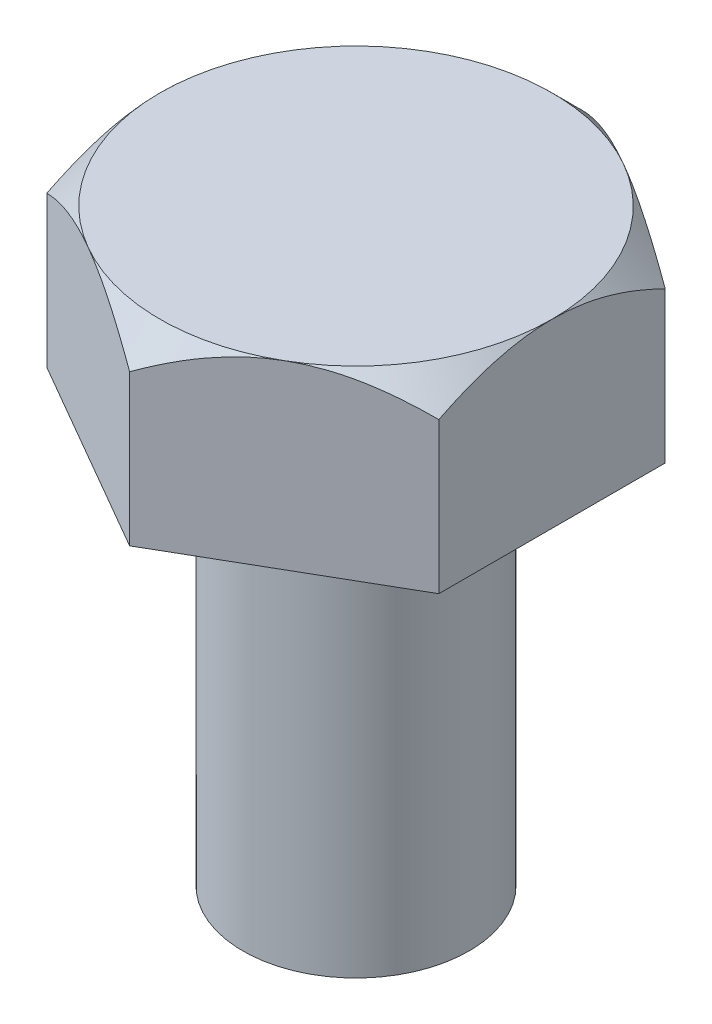
ISO-10303-21;
HEADER;
FILE_DESCRIPTION(('STEP AP214'),'2;1');
FILE_NAME('part.step','',(''),(''),'','','');
FILE_SCHEMA(('AUTOMOTIVE_DESIGN { 1 0 10303 214 1 1 1 1 }'));
ENDSEC;
DATA;
#1=APPLICATION_CONTEXT('core data for automotive mechanical design processes');
#2=APPLICATION_PROTOCOL_DEFINITION('international standard','automotive_design',2000,#1);
#3=PRODUCT_CONTEXT('',#1,'mechanical');
#4=PRODUCT('Part','Part','',(#3));
#5=PRODUCT_RELATED_PRODUCT_CATEGORY('part','',(#4));
#6=PRODUCT_DEFINITION_FORMATION('','',#4);
#7=PRODUCT_DEFINITION_CONTEXT('part definition',#1,'design');
#8=PRODUCT_DEFINITION('design','',#6,#7);
#9=PRODUCT_DEFINITION_SHAPE('','',#8);
#10=(LENGTH_UNIT() NAMED_UNIT(*) SI_UNIT(.MILLI.,.METRE.));
#11=(NAMED_UNIT(*) PLANE_ANGLE_UNIT() SI_UNIT($,.RADIAN.));
#12=(NAMED_UNIT(*) SI_UNIT($,.STERADIAN.) SOLID_ANGLE_UNIT());
#13=UNCERTAINTY_MEASURE_WITH_UNIT(LENGTH_MEASURE(1.E-05),#10,'distance_accuracy_value','');
#14=(GEOMETRIC_REPRESENTATION_CONTEXT(3) GLOBAL_UNCERTAINTY_ASSIGNED_CONTEXT((#13)) GLOBAL_UNIT_ASSIGNED_CONTEXT((#10,
#11,#12)) REPRESENTATION_CONTEXT('',''));
#15=CARTESIAN_POINT('',(0.,0.,0.));
#16=DIRECTION('',(0.,0.,1.));
#17=DIRECTION('',(1.,0.,0.));
#18=AXIS2_PLACEMENT_3D('',#15,#16,#17);
#19=CARTESIAN_POINT('',(-4.33012701892216,4.,2.50000000000005));
#20=DIRECTION('',(0.499999999999995,0.,-0.866025403784441));
#21=DIRECTION('',(-0.866025403784442,0.,-0.499999999999995));
#22=AXIS2_PLACEMENT_3D('',#19,#20,#21);
#23=PLANE('',#22);
#24=CARTESIAN_POINT('',(-4.33032701892216,3.33001154486845,2.49988452994621));
#25=CARTESIAN_POINT('',(-4.25587160985146,3.37299492033943,2.54287138041581));
#26=CARTESIAN_POINT('',(-4.18084389235356,3.41465923494712,2.5861886533099));
#27=CARTESIAN_POINT('',(-4.02953155373265,3.49494847600362,2.67354887274439));
#28=CARTESIAN_POINT('',(-3.95324627322793,3.53357174239125,2.717592199979));
#29=CARTESIAN_POINT('',(-3.72162689198,3.64460746098996,2.85131771209202));
#30=CARTESIAN_POINT('',(-3.56433197010419,3.71171211443313,2.94213197757918));
#31=CARTESIAN_POINT('',(-3.2471341417625,3.8266243667075,3.12526622915862));
#32=CARTESIAN_POINT('',(-3.08731231644054,3.87472148203591,3.21753940303063));
#33=CARTESIAN_POINT('',(-2.84495193082738,3.93035814364011,3.35746623690529));
#34=CARTESIAN_POINT('',(-2.7638083026203,3.9461447544902,3.40431453249367));
#35=CARTESIAN_POINT('',(-2.60083395885697,3.9718577208899,3.49840781373643));
#36=CARTESIAN_POINT('',(-2.51900334785051,3.98178495233195,3.54565273902896));
#37=CARTESIAN_POINT('',(-2.31959642528905,3.99842919206608,3.66078037944809));
#38=CARTESIAN_POINT('',(-2.20180526649963,4.00192167772557,3.72878713668332));
#39=CARTESIAN_POINT('',(-1.9664352172981,3.99606112278933,3.864678097949));
#40=CARTESIAN_POINT('',(-1.8488564157618,3.98670357918647,3.93256225066697));
#41=CARTESIAN_POINT('',(-1.61480729091151,3.95569455734036,4.06769057590288));
#42=CARTESIAN_POINT('',(-1.49833835570955,3.9340293294518,4.13493394699396));
#43=CARTESIAN_POINT('',(-1.26740228961786,3.8795828048479,4.26826494691759));
#44=CARTESIAN_POINT('',(-1.15293500594956,3.84680236044417,4.33435266395689));
#45=CARTESIAN_POINT('',(-0.949729264101407,3.77936088023644,4.45167355371379));
#46=CARTESIAN_POINT('',(-0.860540959930006,3.74647311269324,4.50316644513572));
#47=CARTESIAN_POINT('',(-0.683765489448405,3.67539749907774,4.60522781060439));
#48=CARTESIAN_POINT('',(-0.596178371904862,3.63720949188163,4.6557962564957));
#49=CARTESIAN_POINT('',(-0.422881133456812,3.55638951755014,4.7558494637635));
#50=CARTESIAN_POINT('',(-0.337166083761063,3.51377152504549,4.80533707077894));
#51=CARTESIAN_POINT('',(-0.167323296738404,3.4246511826555,4.90339584958639));
#52=CARTESIAN_POINT('',(-0.0831946239455068,3.37815121569715,4.95196756146993));
#53=CARTESIAN_POINT('',(0.00019999999999939,3.33001154486845,5.00011547005384));
#54=B_SPLINE_CURVE_WITH_KNOTS('',3,(#24,#25,#26,#27,#28,#29,#30,#31,#32,#33,#34,#35,#36,#37,#38,
#39,#40,#41,#42,#43,#44,#45,#46,#47,#48,#49,#50,#51,#52,#53),.UNSPECIFIED.,.F.,.F.,(4,2,2,2,2,2,
2,2,2,2,2,2,2,2,4),(0.,0.28834302505006,0.576842376266663,1.15695604992331,1.72785747296511,
2.01274823950901,2.29759640821261,2.70513724110402,3.11282092407138,3.52096095288676,
3.92906969271703,4.25324617843567,4.57743252106519,4.90062556888116,5.22362166510132),.UNSPECIFIED.);
#55=CARTESIAN_POINT('',(-4.33012701892216,3.33012701892219,2.50000000000005));
#56=VERTEX_POINT('',#55);
#57=CARTESIAN_POINT('',(-2.16506350946107,4.,3.75000000000001));
#58=VERTEX_POINT('',#57);
#59=EDGE_CURVE('E213',#56,#58,#54,.T.);
#60=ORIENTED_EDGE('',*,*,#59,.F.);
#61=DIRECTION('',(0.,-1.,0.));
#62=VECTOR('',#61,1.);
#63=CARTESIAN_POINT('',(-4.33012701892216,4.,2.50000000000005));
#64=LINE('',#63,#62);
#65=CARTESIAN_POINT('',(-4.33012701892216,0.,2.50000000000005));
#66=VERTEX_POINT('',#65);
#67=EDGE_CURVE('E216',#56,#66,#64,.T.);
#68=ORIENTED_EDGE('',*,*,#67,.T.);
#69=DIRECTION('',(0.866025403784441,0.,0.499999999999995));
#70=VECTOR('',#69,1.);
#71=CARTESIAN_POINT('',(-4.33012701892216,0.,2.50000000000005));
#72=LINE('',#71,#70);
#73=CARTESIAN_POINT('',(0.,0.,5.));
#74=VERTEX_POINT('',#73);
#75=EDGE_CURVE('E248',#66,#74,#72,.T.);
#76=ORIENTED_EDGE('',*,*,#75,.T.);
#77=DIRECTION('',(0.,-1.,0.));
#78=VECTOR('',#77,1.);
#79=CARTESIAN_POINT('',(0.,4.,5.));
#80=LINE('',#79,#78);
#81=CARTESIAN_POINT('',(0.,3.33012701892219,5.));
#82=VERTEX_POINT('',#81);
#83=EDGE_CURVE('E237',#82,#74,#80,.T.);
#84=ORIENTED_EDGE('',*,*,#83,.F.);
#85=EDGE_CURVE('E167',#58,#82,#54,.T.);
#86=ORIENTED_EDGE('',*,*,#85,.F.);
#87=EDGE_LOOP('',(#60,#68,#76,#84,#86));
#88=FACE_BOUND('',#87,.T.);
#89=ADVANCED_FACE('F38',(#88),#23,.F.);
#90=CARTESIAN_POINT('',(0.,4.,5.));
#91=DIRECTION('',(-0.500000000000001,0.,-0.866025403784438));
#92=DIRECTION('',(-0.866025403784438,0.,0.500000000000001));
#93=AXIS2_PLACEMENT_3D('',#90,#91,#92);
#94=PLANE('',#93);
#95=CARTESIAN_POINT('',(-0.000200000000000008,3.33001154486845,5.00011547005384));
#96=CARTESIAN_POINT('',(0.0742554090707058,3.37299492033943,4.95712861958424));
#97=CARTESIAN_POINT('',(0.149283126568603,3.41465923494712,4.91381134669015));
#98=CARTESIAN_POINT('',(0.300595465189513,3.49494847600363,4.82645112725565));
#99=CARTESIAN_POINT('',(0.37688074569424,3.53357174239126,4.78240780002104));
#100=CARTESIAN_POINT('',(0.608500126942164,3.64460746098996,4.64868228790802));
#101=CARTESIAN_POINT('',(0.765795048817976,3.71171211443314,4.55786802242086));
#102=CARTESIAN_POINT('',(1.08299287715967,3.82662436670751,4.37473377084142));
#103=CARTESIAN_POINT('',(1.24281470248163,3.87472148203592,4.2824605969694));
#104=CARTESIAN_POINT('',(1.4851750880948,3.93035814364012,4.14253376309474));
#105=CARTESIAN_POINT('',(1.56631871630188,3.94614475449021,4.09568546750636));
#106=CARTESIAN_POINT('',(1.72929306006521,3.97185772088992,4.0015921862636));
#107=CARTESIAN_POINT('',(1.81112367107166,3.98178495233197,3.95434726097107));
#108=CARTESIAN_POINT('',(2.01053059363313,3.99842919206609,3.83921962055193));
#109=CARTESIAN_POINT('',(2.12832175242254,4.00192167772559,3.77121286331671));
#110=CARTESIAN_POINT('',(2.36369180162407,3.99606112278935,3.63532190205103));
#111=CARTESIAN_POINT('',(2.48127060316037,3.98670357918649,3.56743774933305));
#112=CARTESIAN_POINT('',(2.71531972801066,3.95569455734038,3.43230942409714));
#113=CARTESIAN_POINT('',(2.83178866321263,3.93402932945181,3.36506605300606));
#114=CARTESIAN_POINT('',(3.06272472930431,3.87958280484792,3.23173505308243));
#115=CARTESIAN_POINT('',(3.17719201297261,3.84680236044419,3.16564733604313));
#116=CARTESIAN_POINT('',(3.38039775482076,3.77936088023646,3.04832644628622));
#117=CARTESIAN_POINT('',(3.46958605899217,3.74647311269326,2.99683355486429));
#118=CARTESIAN_POINT('',(3.64636152947377,3.67539749907775,2.89477218939561));
#119=CARTESIAN_POINT('',(3.73394864701732,3.63720949188165,2.84420374350431));
#120=CARTESIAN_POINT('',(3.90724588546537,3.55638951755015,2.7441505362365));
#121=CARTESIAN_POINT('',(3.99296093516113,3.5137715250455,2.69466292922106));
#122=CARTESIAN_POINT('',(4.16280372218379,3.42465118265551,2.59660415041361));
#123=CARTESIAN_POINT('',(4.24693239497669,3.37815121569715,2.54803243853006));
#124=CARTESIAN_POINT('',(4.3303270189222,3.33001154486845,2.49988452994615));
#125=B_SPLINE_CURVE_WITH_KNOTS('',3,(#95,#96,#97,#98,#99,#100,#101,#102,#103,#104,#105,#106,
#107,#108,#109,#110,#111,#112,#113,#114,#115,#116,#117,#118,#119,#120,#121,#122,#123,#124),
.UNSPECIFIED.,.F.,.F.,(4,2,2,2,2,2,2,2,2,2,2,2,2,2,4),(0.,0.288343025050063,0.57684237626667,
1.15695604992332,1.72785747296513,2.01274823950903,2.29759640821264,2.70513724110405,
3.1128209240714,3.52096095288679,3.92906969271705,4.2532461784357,4.57743252106524,
4.90062556888122,5.22362166510139),.UNSPECIFIED.);
#126=CARTESIAN_POINT('',(2.1650635094611,4.,3.75));
#127=VERTEX_POINT('',#126);
#128=EDGE_CURVE('E291',#82,#127,#125,.T.);
#129=ORIENTED_EDGE('',*,*,#128,.F.);
#130=ORIENTED_EDGE('',*,*,#83,.T.);
#131=DIRECTION('',(0.866025403784438,0.,-0.500000000000001));
#132=VECTOR('',#131,1.);
#133=CARTESIAN_POINT('',(0.,0.,5.));
#134=LINE('',#133,#132);
#135=CARTESIAN_POINT('',(4.3301270189222,0.,2.49999999999999));
#136=VERTEX_POINT('',#135);
#137=EDGE_CURVE('E250',#74,#136,#134,.T.);
#138=ORIENTED_EDGE('',*,*,#137,.T.);
#139=DIRECTION('',(0.,-1.,0.));
#140=VECTOR('',#139,1.);
#141=CARTESIAN_POINT('',(4.3301270189222,4.,2.49999999999999));
#142=LINE('',#141,#140);
#143=CARTESIAN_POINT('',(4.3301270189222,3.33012701892219,2.49999999999999));
#144=VERTEX_POINT('',#143);
#145=EDGE_CURVE('E236',#144,#136,#142,.T.);
#146=ORIENTED_EDGE('',*,*,#145,.F.);
#147=EDGE_CURVE('E114',#127,#144,#125,.T.);
#148=ORIENTED_EDGE('',*,*,#147,.F.);
#149=EDGE_LOOP('',(#129,#130,#138,#146,#148));
#150=FACE_BOUND('',#149,.T.);
#151=ADVANCED_FACE('F204',(#150),#94,.F.);
#152=CARTESIAN_POINT('',(4.3301270189222,4.,2.49999999999999));
#153=DIRECTION('',(-1.,0.,0.));
#154=DIRECTION('',(0.,0.,1.));
#155=AXIS2_PLACEMENT_3D('',#152,#153,#154);
#156=PLANE('',#155);
#157=CARTESIAN_POINT('',(4.33012701892222,-1.57033673167349,8.90332423743285));
#158=CARTESIAN_POINT('',(4.33012701892222,-1.45367484269554,8.77359372403535));
#159=CARTESIAN_POINT('',(4.33012701892222,-1.33727945032109,8.64362341139327));
#160=CARTESIAN_POINT('',(4.33012701892222,-1.10509903521109,8.38313697699274));
#161=CARTESIAN_POINT('',(4.33012701892222,-0.989314017373425,8.2526208508695));
#162=CARTESIAN_POINT('',(4.33012701892222,-0.642921806261774,7.86007643569822));
#163=CARTESIAN_POINT('',(4.33012701892221,-0.4133498954102,7.59713247560988));
#164=CARTESIAN_POINT('',(4.33012701892221,0.0446286068842534,7.06526855392689));
#165=CARTESIAN_POINT('',(4.33012701892221,0.272996020593539,6.79631473050352));
#166=CARTESIAN_POINT('',(4.33012701892221,0.611742515763763,6.38976041108223));
#167=CARTESIAN_POINT('',(4.33012701892221,0.724012646101129,6.25373574873947));
#168=CARTESIAN_POINT('',(4.33012701892221,0.947066786331409,5.98045222397717));
#169=CARTESIAN_POINT('',(4.33012701892221,1.05785065930126,5.84319324976469));
#170=CARTESIAN_POINT('',(4.33012701892221,1.36830433730922,5.45346089613164));
#171=CARTESIAN_POINT('',(4.33012701892221,1.56591703449882,5.19934061251996));
#172=CARTESIAN_POINT('',(4.33012701892221,1.95287989764238,4.68488393376394));
#173=CARTESIAN_POINT('',(4.3301270189222,2.14223147807056,4.42454861466637));
#174=CARTESIAN_POINT('',(4.3301270189222,2.41692800888356,4.02801362413031));
#175=CARTESIAN_POINT('',(4.3301270189222,2.50684286802491,3.89498233013086));
#176=CARTESIAN_POINT('',(4.3301270189222,2.68291973434548,3.62646525444371));
#177=CARTESIAN_POINT('',(4.3301270189222,2.76908208308723,3.49097969774515));
#178=CARTESIAN_POINT('',(4.3301270189222,2.93670194122,3.21725503933808));
#179=CARTESIAN_POINT('',(4.3301270189222,3.01816292636588,3.07901807615045));
#180=CARTESIAN_POINT('',(4.3301270189222,3.17526497829064,2.79928519127899));
#181=CARTESIAN_POINT('',(4.3301270189222,3.25090709661005,2.65778986445491));
#182=CARTESIAN_POINT('',(4.3301270189222,3.39022181534098,2.38035792048449));
#183=CARTESIAN_POINT('',(4.3301270189222,3.45435197433241,2.24465266081589));
#184=CARTESIAN_POINT('',(4.3301270189222,3.574656420682,1.96971474521902));
#185=CARTESIAN_POINT('',(4.3301270189222,3.63083022308537,1.83048187488553));
#186=CARTESIAN_POINT('',(4.3301270189222,3.73322078512508,1.5487770585132));
#187=CARTESIAN_POINT('',(4.33012701892219,3.77946351607418,1.40631466540163));
#188=CARTESIAN_POINT('',(4.33012701892219,3.86011284379538,1.11809136493189));
#189=CARTESIAN_POINT('',(4.33012701892219,3.89452518082118,0.972332093955235));
#190=CARTESIAN_POINT('',(4.33012701892219,3.94545992500059,0.700274540847432));
#191=CARTESIAN_POINT('',(4.33012701892219,3.96389123769481,0.57433571184203));
#192=CARTESIAN_POINT('',(4.33012701892219,3.98991473088489,0.321341678191874));
#193=CARTESIAN_POINT('',(4.33012701892219,3.9975085253605,0.194286642614703));
#194=CARTESIAN_POINT('',(4.33012701892219,4.00144881168601,-0.0598970646350715));
#195=CARTESIAN_POINT('',(4.33012701892219,3.99780448337781,-0.187025591442655));
#196=CARTESIAN_POINT('',(4.33012701892219,3.97949077234321,-0.44048792801871));
#197=CARTESIAN_POINT('',(4.33012701892219,3.96481967957139,-0.566821611457228));
#198=CARTESIAN_POINT('',(4.33012701892219,3.91955367649874,-0.853499112508738));
#199=CARTESIAN_POINT('',(4.33012701892219,3.88562038593934,-1.01331558017308));
#200=CARTESIAN_POINT('',(4.33012701892219,3.80316439514299,-1.32917470064156));
#201=CARTESIAN_POINT('',(4.33012701892219,3.75463195330209,-1.48521475820211));
#202=CARTESIAN_POINT('',(4.33012701892218,3.67276950375325,-1.71645429081949));
#203=CARTESIAN_POINT('',(4.33012701892218,3.64387974346334,-1.79327046052375));
#204=CARTESIAN_POINT('',(4.33012701892218,3.58341811387854,-1.94580192515183));
#205=CARTESIAN_POINT('',(4.33012701892218,3.55184749854412,-2.02151771557542));
#206=CARTESIAN_POINT('',(4.33012701892218,3.48631252403557,-2.17189298192116));
#207=CARTESIAN_POINT('',(4.33012701892218,3.45234838828262,-2.24655255565585));
#208=CARTESIAN_POINT('',(4.33012701892218,3.38228513863755,-2.39487162500877));
#209=CARTESIAN_POINT('',(4.33012701892218,3.34618575126579,-2.46853099103001));
#210=CARTESIAN_POINT('',(4.33012701892218,3.24702955501736,-2.66441202982776));
#211=CARTESIAN_POINT('',(4.33012701892218,3.18226016506035,-2.78576837690447));
#212=CARTESIAN_POINT('',(4.33012701892218,3.04835730270852,-3.02605740995251));
#213=CARTESIAN_POINT('',(4.33012701892218,2.97922304726001,-3.14498965595038));
#214=CARTESIAN_POINT('',(4.33012701892218,2.76638934146719,-3.49868630626234));
#215=CARTESIAN_POINT('',(4.33012701892218,2.61732565461091,-3.73022285915576));
#216=CARTESIAN_POINT('',(4.33012701892218,2.3089974978902,-4.18717151517887));
#217=CARTESIAN_POINT('',(4.33012701892218,2.14970753711063,-4.41256614778243));
#218=CARTESIAN_POINT('',(4.33012701892217,1.82412197734654,-4.85810627697252));
#219=CARTESIAN_POINT('',(4.33012701892217,1.65782857049704,-5.07825338278369));
#220=CARTESIAN_POINT('',(4.33012701892217,1.31946709770787,-5.51529889124858));
#221=CARTESIAN_POINT('',(4.33012701892217,1.1473805697958,-5.73218292616215));
#222=CARTESIAN_POINT('',(4.33012701892217,0.799268867177788,-6.16278072868351));
#223=CARTESIAN_POINT('',(4.33012701892217,0.623243436654966,-6.37649428887316));
#224=CARTESIAN_POINT('',(4.33012701892217,0.268398008365141,-6.80110576416483));
#225=CARTESIAN_POINT('',(4.33012701892217,0.0895819873744247,-7.01200701057427));
#226=CARTESIAN_POINT('',(4.33012701892217,-0.270422789812915,-7.43176242196086));
#227=CARTESIAN_POINT('',(4.33012701892217,-0.451611487779737,-7.64061663695675));
#228=CARTESIAN_POINT('',(4.33012701892216,-0.788912357501434,-8.02584653913024));
#229=CARTESIAN_POINT('',(4.33012701892216,-0.944763796067647,-8.20245091257009));
#230=CARTESIAN_POINT('',(4.33012701892216,-1.25703447341025,-8.55395138171449));
#231=CARTESIAN_POINT('',(4.33012701892216,-1.4134492649747,-8.7288514267675));
#232=CARTESIAN_POINT('',(4.33012701892216,-1.57033673167349,-8.90332423743288));
#233=B_SPLINE_CURVE_WITH_KNOTS('',3,(#157,#158,#159,#160,#161,#162,#163,#164,#165,#166,#167,
#168,#169,#170,#171,#172,#173,#174,#175,#176,#177,#178,#179,#180,#181,#182,#183,#184,#185,#186,
#187,#188,#189,#190,#191,#192,#193,#194,#195,#196,#197,#198,#199,#200,#201,#202,#203,#204,#205,
#206,#207,#208,#209,#210,#211,#212,#213,#214,#215,#216,#217,#218,#219,#220,#221,#222,#223,#224,
#225,#226,#227,#228,#229,#230,#231,#232),.UNSPECIFIED.,.F.,.F.,(4,2,2,2,2,2,2,2,2,2,2,2,2,2,2,2,
2,2,2,2,2,2,2,2,2,2,2,2,2,2,2,2,2,2,2,2,2,4),(0.,0.523411496049795,1.04682718577394,
2.09398313596665,3.15241670413788,3.68152550137059,4.21068271314228,5.17631419069355,
6.14177967802375,6.62343462040014,7.10504562936267,7.58629589406516,8.06745898564357,
8.51754017126108,8.96764877837231,9.41656554687358,9.86526418694706,10.246676195505,
10.628031396268,11.0090751702091,11.3901780491258,11.8794803992404,12.3691099740729,
12.6152765072058,12.8613285244576,13.1073576045335,13.3534182641468,13.7659743535893,
14.1786046667622,15.0042968632216,15.832133805225,16.6597135259092,17.4902415438086,
18.3208236588329,19.1503141874776,19.979784396929,20.6863971747288,21.3903090973452),.UNSPECIFIED.);
#234=CARTESIAN_POINT('',(4.33012701892219,4.,0.));
#235=VERTEX_POINT('',#234);
#236=EDGE_CURVE('E110',#144,#235,#233,.T.);
#237=ORIENTED_EDGE('',*,*,#236,.F.);
#238=ORIENTED_EDGE('',*,*,#145,.T.);
#239=DIRECTION('',(0.,0.,-1.));
#240=VECTOR('',#239,1.);
#241=CARTESIAN_POINT('',(4.3301270189222,0.,2.49999999999999));
#242=LINE('',#241,#240);
#243=CARTESIAN_POINT('',(4.33012701892218,0.,-2.50000000000002));
#244=VERTEX_POINT('',#243);
#245=EDGE_CURVE('E252',#136,#244,#242,.T.);
#246=ORIENTED_EDGE('',*,*,#245,.T.);
#247=DIRECTION('',(0.,-1.,0.));
#248=VECTOR('',#247,1.);
#249=CARTESIAN_POINT('',(4.33012701892218,4.,-2.50000000000002));
#250=LINE('',#249,#248);
#251=CARTESIAN_POINT('',(4.33012701892218,3.33012701892219,-2.50000000000002));
#252=VERTEX_POINT('',#251);
#253=EDGE_CURVE('E134',#252,#244,#250,.T.);
#254=ORIENTED_EDGE('',*,*,#253,.F.);
#255=EDGE_CURVE('E118',#235,#252,#233,.T.);
#256=ORIENTED_EDGE('',*,*,#255,.F.);
#257=EDGE_LOOP('',(#237,#238,#246,#254,#256));
#258=FACE_BOUND('',#257,.T.);
#259=ADVANCED_FACE('F132',(#258),#156,.F.);
#260=CARTESIAN_POINT('',(4.33012701892218,4.,-2.50000000000002));
#261=DIRECTION('',(-0.499999999999995,0.,0.866025403784442));
#262=DIRECTION('',(0.866025403784442,0.,0.499999999999995));
#263=AXIS2_PLACEMENT_3D('',#260,#261,#262);
#264=PLANE('',#263);
#265=CARTESIAN_POINT('',(4.33032701892218,3.33001154486845,-2.49988452994618));
#266=CARTESIAN_POINT('',(4.25587160985148,3.37299492033943,-2.54287138041578));
#267=CARTESIAN_POINT('',(4.18084389235358,3.41465923494712,-2.58618865330987));
#268=CARTESIAN_POINT('',(4.02953155373267,3.49494847600363,-2.67354887274436));
#269=CARTESIAN_POINT('',(3.95324627322794,3.53357174239126,-2.71759219997897));
#270=CARTESIAN_POINT('',(3.72162689198001,3.64460746098997,-2.851317712092));
#271=CARTESIAN_POINT('',(3.5643319701042,3.71171211443314,-2.94213197757916));
#272=CARTESIAN_POINT('',(3.24713414176251,3.82662436670751,-3.1252662291586));
#273=CARTESIAN_POINT('',(3.08731231644054,3.87472148203593,-3.21753940303061));
#274=CARTESIAN_POINT('',(2.84495193082738,3.93035814364012,-3.35746623690527));
#275=CARTESIAN_POINT('',(2.7638083026203,3.94614475449021,-3.40431453249365));
#276=CARTESIAN_POINT('',(2.60083395885697,3.97185772088992,-3.49840781373641));
#277=CARTESIAN_POINT('',(2.51900334785051,3.98178495233197,-3.54565273902894));
#278=CARTESIAN_POINT('',(2.31959642528904,3.99842919206609,-3.66078037944807));
#279=CARTESIAN_POINT('',(2.20180526649963,4.00192167772559,-3.7287871366833));
#280=CARTESIAN_POINT('',(1.9664352172981,3.99606112278935,-3.86467809794898));
#281=CARTESIAN_POINT('',(1.8488564157618,3.98670357918649,-3.93256225066695));
#282=CARTESIAN_POINT('',(1.61480729091151,3.95569455734038,-4.06769057590286));
#283=CARTESIAN_POINT('',(1.49833835570955,3.93402932945182,-4.13493394699394));
#284=CARTESIAN_POINT('',(1.26740228961786,3.87958280484792,-4.26826494691757));
#285=CARTESIAN_POINT('',(1.15293500594957,3.84680236044419,-4.33435266395686));
#286=CARTESIAN_POINT('',(0.949729264101405,3.77936088023646,-4.45167355371378));
#287=CARTESIAN_POINT('',(0.860540959930001,3.74647311269326,-4.5031664451357));
#288=CARTESIAN_POINT('',(0.683765489448392,3.67539749907775,-4.60522781060438));
#289=CARTESIAN_POINT('',(0.596178371904846,3.63720949188165,-4.65579625649569));
#290=CARTESIAN_POINT('',(0.422881133456791,3.55638951755015,-4.75584946376349));
#291=CARTESIAN_POINT('',(0.337166083761039,3.5137715250455,-4.80533707077893));
#292=CARTESIAN_POINT('',(0.167323296738374,3.42465118265551,-4.90339584958638));
#293=CARTESIAN_POINT('',(0.0831946239454737,3.37815121569715,-4.95196756146993));
#294=CARTESIAN_POINT('',(-0.00020000000003525,3.33001154486845,-5.00011547005384));
#295=B_SPLINE_CURVE_WITH_KNOTS('',3,(#265,#266,#267,#268,#269,#270,#271,#272,#273,#274,#275,
#276,#277,#278,#279,#280,#281,#282,#283,#284,#285,#286,#287,#288,#289,#290,#291,#292,#293,#294),
.UNSPECIFIED.,.F.,.F.,(4,2,2,2,2,2,2,2,2,2,2,2,2,2,4),(0.,0.288343025050064,0.576842376266671,
1.15695604992333,1.72785747296513,2.01274823950903,2.29759640821264,2.70513724110405,
3.1128209240714,3.52096095288678,3.92906969271705,4.2532461784357,4.57743252106524,
4.90062556888122,5.22362166510139),.UNSPECIFIED.);
#296=CARTESIAN_POINT('',(2.16506350946107,4.,-3.75000000000001));
#297=VERTEX_POINT('',#296);
#298=EDGE_CURVE('E123',#252,#297,#295,.T.);
#299=ORIENTED_EDGE('',*,*,#298,.F.);
#300=ORIENTED_EDGE('',*,*,#253,.T.);
#301=DIRECTION('',(-0.866025403784442,0.,-0.499999999999995));
#302=VECTOR('',#301,1.);
#303=CARTESIAN_POINT('',(4.33012701892218,0.,-2.50000000000002));
#304=LINE('',#303,#302);
#305=CARTESIAN_POINT('',(0.,0.,-5.));
#306=VERTEX_POINT('',#305);
#307=EDGE_CURVE('E254',#244,#306,#304,.T.);
#308=ORIENTED_EDGE('',*,*,#307,.T.);
#309=DIRECTION('',(0.,-1.,0.));
#310=VECTOR('',#309,1.);
#311=CARTESIAN_POINT('',(0.,4.,-5.));
#312=LINE('',#311,#310);
#313=CARTESIAN_POINT('',(0.,3.33012701892219,-5.));
#314=VERTEX_POINT('',#313);
#315=EDGE_CURVE('E228',#314,#306,#312,.T.);
#316=ORIENTED_EDGE('',*,*,#315,.F.);
#317=EDGE_CURVE('E135',#297,#314,#295,.T.);
#318=ORIENTED_EDGE('',*,*,#317,.F.);
#319=EDGE_LOOP('',(#299,#300,#308,#316,#318));
#320=FACE_BOUND('',#319,.T.);
#321=ADVANCED_FACE('F194',(#320),#264,.F.);
#322=CARTESIAN_POINT('',(0.,4.,-5.));
#323=DIRECTION('',(0.500000000000007,0.,0.866025403784435));
#324=DIRECTION('',(0.866025403784435,0.,-0.500000000000007));
#325=AXIS2_PLACEMENT_3D('',#322,#323,#324);
#326=PLANE('',#325);
#327=CARTESIAN_POINT('',(0.000199999999965085,3.33001154486845,-5.00011547005384));
#328=CARTESIAN_POINT('',(-0.0742554090707405,3.37299492033943,-4.95712861958424));
#329=CARTESIAN_POINT('',(-0.149283126568638,3.41465923494712,-4.91381134669014));
#330=CARTESIAN_POINT('',(-0.300595465189546,3.49494847600363,-4.82645112725565));
#331=CARTESIAN_POINT('',(-0.376880745694273,3.53357174239126,-4.78240780002104));
#332=CARTESIAN_POINT('',(-0.608500126942197,3.64460746098997,-4.64868228790801));
#333=CARTESIAN_POINT('',(-0.765795048818007,3.71171211443314,-4.55786802242085));
#334=CARTESIAN_POINT('',(-1.0829928771597,3.82662436670751,-4.37473377084141));
#335=CARTESIAN_POINT('',(-1.24281470248166,3.87472148203593,-4.28246059696939));
#336=CARTESIAN_POINT('',(-1.48517508809483,3.93035814364012,-4.14253376309473));
#337=CARTESIAN_POINT('',(-1.56631871630191,3.94614475449021,-4.09568546750635));
#338=CARTESIAN_POINT('',(-1.72929306006524,3.97185772088992,-4.00159218626358));
#339=CARTESIAN_POINT('',(-1.81112367107169,3.98178495233197,-3.95434726097106));
#340=CARTESIAN_POINT('',(-2.01053059363316,3.99842919206609,-3.83921962055192));
#341=CARTESIAN_POINT('',(-2.12832175242257,4.00192167772559,-3.77121286331669));
#342=CARTESIAN_POINT('',(-2.3636918016241,3.99606112278935,-3.63532190205101));
#343=CARTESIAN_POINT('',(-2.4812706031604,3.98670357918649,-3.56743774933303));
#344=CARTESIAN_POINT('',(-2.71531972801069,3.95569455734038,-3.43230942409712));
#345=CARTESIAN_POINT('',(-2.83178866321265,3.93402932945181,-3.36506605300604));
#346=CARTESIAN_POINT('',(-3.06272472930433,3.87958280484792,-3.23173505308241));
#347=CARTESIAN_POINT('',(-3.17719201297263,3.84680236044418,-3.16564733604311));
#348=CARTESIAN_POINT('',(-3.38039775482079,3.77936088023646,-3.0483264462862));
#349=CARTESIAN_POINT('',(-3.46958605899219,3.74647311269326,-2.99683355486427));
#350=CARTESIAN_POINT('',(-3.64636152947379,3.67539749907775,-2.89477218939559));
#351=CARTESIAN_POINT('',(-3.73394864701734,3.63720949188165,-2.84420374350428));
#352=CARTESIAN_POINT('',(-3.90724588546539,3.55638951755015,-2.74415053623648));
#353=CARTESIAN_POINT('',(-3.99296093516114,3.5137715250455,-2.69466292922103));
#354=CARTESIAN_POINT('',(-4.16280372218381,3.42465118265551,-2.59660415041358));
#355=CARTESIAN_POINT('',(-4.24693239497671,3.37815121569715,-2.54803243853003));
#356=CARTESIAN_POINT('',(-4.33032701892221,3.33001154486845,-2.49988452994612));
#357=B_SPLINE_CURVE_WITH_KNOTS('',3,(#327,#328,#329,#330,#331,#332,#333,#334,#335,#336,#337,
#338,#339,#340,#341,#342,#343,#344,#345,#346,#347,#348,#349,#350,#351,#352,#353,#354,#355,#356),
.UNSPECIFIED.,.F.,.F.,(4,2,2,2,2,2,2,2,2,2,2,2,2,2,4),(0.,0.288343025050063,0.576842376266669,
1.15695604992332,1.72785747296513,2.01274823950903,2.29759640821264,2.70513724110405,
3.1128209240714,3.52096095288679,3.92906969271705,4.2532461784357,4.57743252106523,
4.90062556888122,5.22362166510139),.UNSPECIFIED.);
#358=CARTESIAN_POINT('',(-2.16506350946113,4.,-3.74999999999998));
#359=VERTEX_POINT('',#358);
#360=EDGE_CURVE('E188',#314,#359,#357,.T.);
#361=ORIENTED_EDGE('',*,*,#360,.F.);
#362=ORIENTED_EDGE('',*,*,#315,.T.);
#363=DIRECTION('',(-0.866025403784435,0.,0.500000000000007));
#364=VECTOR('',#363,1.);
#365=CARTESIAN_POINT('',(0.,0.,-5.));
#366=LINE('',#365,#364);
#367=CARTESIAN_POINT('',(-4.33012701892222,0.,-2.49999999999996));
#368=VERTEX_POINT('',#367);
#369=EDGE_CURVE('E230',#306,#368,#366,.T.);
#370=ORIENTED_EDGE('',*,*,#369,.T.);
#371=DIRECTION('',(0.,-1.,0.));
#372=VECTOR('',#371,1.);
#373=CARTESIAN_POINT('',(-4.33012701892222,4.,-2.49999999999996));
#374=LINE('',#373,#372);
#375=CARTESIAN_POINT('',(-4.33012701892222,3.33012701892219,-2.49999999999996));
#376=VERTEX_POINT('',#375);
#377=EDGE_CURVE('E226',#376,#368,#374,.T.);
#378=ORIENTED_EDGE('',*,*,#377,.F.);
#379=EDGE_CURVE('E182',#359,#376,#357,.T.);
#380=ORIENTED_EDGE('',*,*,#379,.F.);
#381=EDGE_LOOP('',(#361,#362,#370,#378,#380));
#382=FACE_BOUND('',#381,.T.);
#383=ADVANCED_FACE('F190',(#382),#326,.F.);
#384=CARTESIAN_POINT('',(-4.33012701892222,4.,-2.49999999999996));
#385=DIRECTION('',(1.,0.,0.));
#386=DIRECTION('',(0.,0.,-1.));
#387=AXIS2_PLACEMENT_3D('',#384,#385,#386);
#388=PLANE('',#387);
#389=CARTESIAN_POINT('',(-4.33012701892228,-1.57033673167349,-8.90332423743282));
#390=CARTESIAN_POINT('',(-4.33012701892228,-1.45367484269554,-8.77359372403532));
#391=CARTESIAN_POINT('',(-4.33012701892228,-1.33727945032109,-8.64362341139324));
#392=CARTESIAN_POINT('',(-4.33012701892228,-1.1050990352111,-8.38313697699271));
#393=CARTESIAN_POINT('',(-4.33012701892228,-0.989314017373426,-8.25262085086947));
#394=CARTESIAN_POINT('',(-4.33012701892227,-0.642921806261776,-7.86007643569819));
#395=CARTESIAN_POINT('',(-4.33012701892227,-0.413349895410201,-7.59713247560985));
#396=CARTESIAN_POINT('',(-4.33012701892227,0.0446286068842534,-7.06526855392686));
#397=CARTESIAN_POINT('',(-4.33012701892226,0.272996020593539,-6.79631473050349));
#398=CARTESIAN_POINT('',(-4.33012701892226,0.611742515763763,-6.3897604110822));
#399=CARTESIAN_POINT('',(-4.33012701892226,0.724012646101129,-6.25373574873944));
#400=CARTESIAN_POINT('',(-4.33012701892225,0.947066786331409,-5.98045222397714));
#401=CARTESIAN_POINT('',(-4.33012701892225,1.05785065930126,-5.84319324976466));
#402=CARTESIAN_POINT('',(-4.33012701892225,1.36830433730922,-5.45346089613161));
#403=CARTESIAN_POINT('',(-4.33012701892225,1.56591703449882,-5.19934061251994));
#404=CARTESIAN_POINT('',(-4.33012701892224,1.95287989764238,-4.68488393376391));
#405=CARTESIAN_POINT('',(-4.33012701892224,2.14223147807055,-4.42454861466634));
#406=CARTESIAN_POINT('',(-4.33012701892223,2.41692800888356,-4.02801362413028));
#407=CARTESIAN_POINT('',(-4.33012701892223,2.50684286802491,-3.89498233013083));
#408=CARTESIAN_POINT('',(-4.33012701892223,2.68291973434548,-3.62646525444368));
#409=CARTESIAN_POINT('',(-4.33012701892223,2.76908208308723,-3.49097969774512));
#410=CARTESIAN_POINT('',(-4.33012701892222,2.93670194122,-3.21725503933805));
#411=CARTESIAN_POINT('',(-4.33012701892222,3.01816292636588,-3.07901807615043));
#412=CARTESIAN_POINT('',(-4.33012701892222,3.17526497829064,-2.79928519127896));
#413=CARTESIAN_POINT('',(-4.33012701892222,3.25090709661005,-2.65778986445488));
#414=CARTESIAN_POINT('',(-4.33012701892221,3.39022181534098,-2.38035792048446));
#415=CARTESIAN_POINT('',(-4.33012701892221,3.45435197433241,-2.24465266081586));
#416=CARTESIAN_POINT('',(-4.33012701892221,3.574656420682,-1.96971474521899));
#417=CARTESIAN_POINT('',(-4.33012701892221,3.63083022308537,-1.8304818748855));
#418=CARTESIAN_POINT('',(-4.33012701892221,3.73322078512508,-1.54877705851318));
#419=CARTESIAN_POINT('',(-4.33012701892221,3.77946351607418,-1.40631466540161));
#420=CARTESIAN_POINT('',(-4.3301270189222,3.86011284379538,-1.11809136493186));
#421=CARTESIAN_POINT('',(-4.3301270189222,3.89452518082118,-0.972332093955207));
#422=CARTESIAN_POINT('',(-4.3301270189222,3.94545992500059,-0.700274540847403));
#423=CARTESIAN_POINT('',(-4.3301270189222,3.9638912376948,-0.574335711842001));
#424=CARTESIAN_POINT('',(-4.33012701892219,3.98991473088489,-0.321341678191845));
#425=CARTESIAN_POINT('',(-4.33012701892219,3.9975085253605,-0.194286642614675));
#426=CARTESIAN_POINT('',(-4.33012701892219,4.00144881168601,0.0598970646350993));
#427=CARTESIAN_POINT('',(-4.33012701892219,3.99780448337781,0.187025591442683));
#428=CARTESIAN_POINT('',(-4.33012701892219,3.97949077234321,0.440487928018738));
#429=CARTESIAN_POINT('',(-4.33012701892218,3.96481967957139,0.566821611457256));
#430=CARTESIAN_POINT('',(-4.33012701892218,3.91955367649875,0.853499112508765));
#431=CARTESIAN_POINT('',(-4.33012701892218,3.88562038593934,1.01331558017311));
#432=CARTESIAN_POINT('',(-4.33012701892218,3.80316439514299,1.32917470064158));
#433=CARTESIAN_POINT('',(-4.33012701892217,3.75463195330209,1.48521475820213));
#434=CARTESIAN_POINT('',(-4.33012701892217,3.67276950375325,1.71645429081951));
#435=CARTESIAN_POINT('',(-4.33012701892217,3.64387974346335,1.79327046052377));
#436=CARTESIAN_POINT('',(-4.33012701892217,3.58341811387854,1.94580192515185));
#437=CARTESIAN_POINT('',(-4.33012701892217,3.55184749854412,2.02151771557545));
#438=CARTESIAN_POINT('',(-4.33012701892217,3.48631252403558,2.17189298192119));
#439=CARTESIAN_POINT('',(-4.33012701892217,3.45234838828262,2.24655255565587));
#440=CARTESIAN_POINT('',(-4.33012701892216,3.38228513863756,2.3948716250088));
#441=CARTESIAN_POINT('',(-4.33012701892216,3.34618575126579,2.46853099103003));
#442=CARTESIAN_POINT('',(-4.33012701892216,3.24702955501736,2.66441202982779));
#443=CARTESIAN_POINT('',(-4.33012701892216,3.18226016506036,2.7857683769045));
#444=CARTESIAN_POINT('',(-4.33012701892216,3.04835730270852,3.02605740995253));
#445=CARTESIAN_POINT('',(-4.33012701892216,2.97922304726001,3.14498965595041));
#446=CARTESIAN_POINT('',(-4.33012701892215,2.7663893414672,3.49868630626237));
#447=CARTESIAN_POINT('',(-4.33012701892215,2.61732565461092,3.73022285915579));
#448=CARTESIAN_POINT('',(-4.33012701892215,2.30899749789021,4.1871715151789));
#449=CARTESIAN_POINT('',(-4.33012701892214,2.14970753711064,4.41256614778245));
#450=CARTESIAN_POINT('',(-4.33012701892214,1.82412197734655,4.85810627697254));
#451=CARTESIAN_POINT('',(-4.33012701892214,1.65782857049705,5.0782533827837));
#452=CARTESIAN_POINT('',(-4.33012701892213,1.31946709770788,5.51529889124859));
#453=CARTESIAN_POINT('',(-4.33012701892213,1.14738056979581,5.73218292616217));
#454=CARTESIAN_POINT('',(-4.33012701892212,0.799268867177802,6.16278072868353));
#455=CARTESIAN_POINT('',(-4.33012701892212,0.623243436654981,6.37649428887318));
#456=CARTESIAN_POINT('',(-4.33012701892212,0.268398008365158,6.80110576416484));
#457=CARTESIAN_POINT('',(-4.33012701892212,0.0895819873744421,7.01200701057428));
#458=CARTESIAN_POINT('',(-4.33012701892211,-0.270422789812898,7.43176242196087));
#459=CARTESIAN_POINT('',(-4.33012701892211,-0.451611487779721,7.64061663695676));
#460=CARTESIAN_POINT('',(-4.33012701892211,-0.788912357501421,8.02584653913025));
#461=CARTESIAN_POINT('',(-4.3301270189221,-0.944763796067635,8.20245091257011));
#462=CARTESIAN_POINT('',(-4.3301270189221,-1.25703447341025,8.55395138171451));
#463=CARTESIAN_POINT('',(-4.3301270189221,-1.41344926497469,8.72885142676753));
#464=CARTESIAN_POINT('',(-4.3301270189221,-1.57033673167348,8.9033242374329));
#465=B_SPLINE_CURVE_WITH_KNOTS('',3,(#389,#390,#391,#392,#393,#394,#395,#396,#397,#398,#399,
#400,#401,#402,#403,#404,#405,#406,#407,#408,#409,#410,#411,#412,#413,#414,#415,#416,#417,#418,
#419,#420,#421,#422,#423,#424,#425,#426,#427,#428,#429,#430,#431,#432,#433,#434,#435,#436,#437,
#438,#439,#440,#441,#442,#443,#444,#445,#446,#447,#448,#449,#450,#451,#452,#453,#454,#455,#456,
#457,#458,#459,#460,#461,#462,#463,#464),.UNSPECIFIED.,.F.,.F.,(4,2,2,2,2,2,2,2,2,2,2,2,2,2,2,2,
2,2,2,2,2,2,2,2,2,2,2,2,2,2,2,2,2,2,2,2,2,4),(0.,0.523411496049794,1.04682718577394,
2.09398313596665,3.15241670413788,3.68152550137059,4.21068271314228,5.17631419069355,
6.14177967802375,6.62343462040014,7.10504562936266,7.58629589406516,8.06745898564357,
8.51754017126107,8.96764877837231,9.41656554687357,9.86526418694706,10.246676195505,
10.628031396268,11.0090751702091,11.3901780491258,11.8794803992404,12.3691099740729,
12.6152765072058,12.8613285244576,13.1073576045335,13.3534182641467,13.7659743535893,
14.1786046667622,15.0042968632216,15.832133805225,16.6597135259092,17.4902415438086,
18.3208236588328,19.1503141874775,19.9797843969289,20.6863971747288,21.3903090973452),.UNSPECIFIED.);
#466=CARTESIAN_POINT('',(-4.33012701892219,4.,0.));
#467=VERTEX_POINT('',#466);
#468=EDGE_CURVE('E189',#376,#467,#465,.T.);
#469=ORIENTED_EDGE('',*,*,#468,.F.);
#470=ORIENTED_EDGE('',*,*,#377,.T.);
#471=DIRECTION('',(0.,0.,1.));
#472=VECTOR('',#471,1.);
#473=CARTESIAN_POINT('',(-4.33012701892222,0.,-2.49999999999996));
#474=LINE('',#473,#472);
#475=EDGE_CURVE('E224',#368,#66,#474,.T.);
#476=ORIENTED_EDGE('',*,*,#475,.T.);
#477=ORIENTED_EDGE('',*,*,#67,.F.);
#478=EDGE_CURVE('E129',#467,#56,#465,.T.);
#479=ORIENTED_EDGE('',*,*,#478,.F.);
#480=EDGE_LOOP('',(#469,#470,#476,#477,#479));
#481=FACE_BOUND('',#480,.T.);
#482=ADVANCED_FACE('F193',(#481),#388,.F.);
#483=CARTESIAN_POINT('',(0.,0.,0.));
#484=DIRECTION('',(0.,1.,0.));
#485=DIRECTION('',(0.,0.,1.));
#486=AXIS2_PLACEMENT_3D('',#483,#484,#485);
#487=PLANE('',#486);
#488=CARTESIAN_POINT('',(0.,0.,0.));
#489=DIRECTION('',(0.,-1.,0.));
#490=DIRECTION('',(0.,0.,-1.));
#491=AXIS2_PLACEMENT_3D('',#488,#489,#490);
#492=CIRCLE('',#491,2.5);
#493=CARTESIAN_POINT('',(0.,0.,-2.5));
#494=VERTEX_POINT('',#493);
#495=EDGE_CURVE('E238',#494,#494,#492,.T.);
#496=ORIENTED_EDGE('',*,*,#495,.F.);
#497=EDGE_LOOP('',(#496));
#498=FACE_BOUND('',#497,.T.);
#499=ORIENTED_EDGE('',*,*,#75,.F.);
#500=ORIENTED_EDGE('',*,*,#475,.F.);
#501=ORIENTED_EDGE('',*,*,#369,.F.);
#502=ORIENTED_EDGE('',*,*,#307,.F.);
#503=ORIENTED_EDGE('',*,*,#245,.F.);
#504=ORIENTED_EDGE('',*,*,#137,.F.);
#505=EDGE_LOOP('',(#499,#500,#501,#502,#503,#504));
#506=FACE_BOUND('',#505,.T.);
#507=ADVANCED_FACE('F264',(#498,#506),#487,.F.);
#508=CARTESIAN_POINT('',(0.,-9.,0.));
#509=DIRECTION('',(0.,1.,0.));
#510=DIRECTION('',(0.,0.,1.));
#511=AXIS2_PLACEMENT_3D('',#508,#509,#510);
#512=CYLINDRICAL_SURFACE('',#511,2.5);
#513=CARTESIAN_POINT('',(0.,-9.,0.));
#514=DIRECTION('',(0.,-1.,0.));
#515=DIRECTION('',(0.,0.,-1.));
#516=AXIS2_PLACEMENT_3D('',#513,#514,#515);
#517=CIRCLE('',#516,2.5);
#518=CARTESIAN_POINT('',(0.,-9.,-2.5));
#519=VERTEX_POINT('',#518);
#520=EDGE_CURVE('E219',#519,#519,#517,.T.);
#521=ORIENTED_EDGE('',*,*,#520,.F.);
#522=EDGE_LOOP('',(#521));
#523=FACE_BOUND('',#522,.T.);
#524=ORIENTED_EDGE('',*,*,#495,.T.);
#525=EDGE_LOOP('',(#524));
#526=FACE_BOUND('',#525,.T.);
#527=ADVANCED_FACE('F289',(#523,#526),#512,.T.);
#528=CARTESIAN_POINT('',(0.,-9.,0.));
#529=DIRECTION('',(0.,-1.,0.));
#530=DIRECTION('',(0.,0.,-1.));
#531=AXIS2_PLACEMENT_3D('',#528,#529,#530);
#532=PLANE('',#531);
#533=ORIENTED_EDGE('',*,*,#520,.T.);
#534=EDGE_LOOP('',(#533));
#535=FACE_BOUND('',#534,.T.);
#536=ADVANCED_FACE('F163',(#535),#532,.T.);
#537=CARTESIAN_POINT('',(0.,4.,0.));
#538=DIRECTION('',(0.,-1.,0.));
#539=DIRECTION('',(0.,0.,1.));
#540=AXIS2_PLACEMENT_3D('',#537,#538,#539);
#541=CONICAL_SURFACE('',#540,4.33012701892219,0.78539816339745);
#542=ORIENTED_EDGE('',*,*,#85,.T.);
#543=ORIENTED_EDGE('',*,*,#128,.T.);
#544=CARTESIAN_POINT('',(0.,4.,0.));
#545=DIRECTION('',(0.,1.,0.));
#546=DIRECTION('',(0.,0.,1.));
#547=AXIS2_PLACEMENT_3D('',#544,#545,#546);
#548=CIRCLE('',#547,4.33012701892219);
#549=EDGE_CURVE('E42',#58,#127,#548,.T.);
#550=ORIENTED_EDGE('',*,*,#549,.F.);
#551=EDGE_LOOP('',(#542,#543,#550));
#552=FACE_BOUND('',#551,.T.);
#553=ADVANCED_FACE('F161',(#552),#541,.T.);
#554=ORIENTED_EDGE('',*,*,#59,.T.);
#555=EDGE_CURVE('E246',#467,#58,#548,.T.);
#556=ORIENTED_EDGE('',*,*,#555,.F.);
#557=ORIENTED_EDGE('',*,*,#478,.T.);
#558=EDGE_LOOP('',(#554,#556,#557));
#559=FACE_BOUND('',#558,.T.);
#560=ADVANCED_FACE('F156',(#559),#541,.T.);
#561=ORIENTED_EDGE('',*,*,#379,.T.);
#562=ORIENTED_EDGE('',*,*,#468,.T.);
#563=EDGE_CURVE('E62',#359,#467,#548,.T.);
#564=ORIENTED_EDGE('',*,*,#563,.F.);
#565=EDGE_LOOP('',(#561,#562,#564));
#566=FACE_BOUND('',#565,.T.);
#567=ADVANCED_FACE('F160',(#566),#541,.T.);
#568=ORIENTED_EDGE('',*,*,#317,.T.);
#569=ORIENTED_EDGE('',*,*,#360,.T.);
#570=EDGE_CURVE('E47',#297,#359,#548,.T.);
#571=ORIENTED_EDGE('',*,*,#570,.F.);
#572=EDGE_LOOP('',(#568,#569,#571));
#573=FACE_BOUND('',#572,.T.);
#574=ADVANCED_FACE('F267',(#573),#541,.T.);
#575=ORIENTED_EDGE('',*,*,#255,.T.);
#576=ORIENTED_EDGE('',*,*,#298,.T.);
#577=EDGE_CURVE('E12',#235,#297,#548,.T.);
#578=ORIENTED_EDGE('',*,*,#577,.F.);
#579=EDGE_LOOP('',(#575,#576,#578));
#580=FACE_BOUND('',#579,.T.);
#581=ADVANCED_FACE('F121',(#580),#541,.T.);
#582=ORIENTED_EDGE('',*,*,#147,.T.);
#583=ORIENTED_EDGE('',*,*,#236,.T.);
#584=CARTESIAN_POINT('',(0.,4.,0.));
#585=DIRECTION('',(0.,1.,0.));
#586=DIRECTION('',(0.,0.,1.));
#587=AXIS2_PLACEMENT_3D('',#584,#585,#586);
#588=CIRCLE('',#587,4.33012701892219);
#589=EDGE_CURVE('E54',#127,#235,#588,.T.);
#590=ORIENTED_EDGE('',*,*,#589,.F.);
#591=EDGE_LOOP('',(#582,#583,#590));
#592=FACE_BOUND('',#591,.T.);
#593=ADVANCED_FACE('F112',(#592),#541,.T.);
#594=CARTESIAN_POINT('',(0.,4.,0.));
#595=DIRECTION('',(0.,1.,0.));
#596=DIRECTION('',(0.,0.,1.));
#597=AXIS2_PLACEMENT_3D('',#594,#595,#596);
#598=PLANE('',#597);
#599=ORIENTED_EDGE('',*,*,#549,.T.);
#600=ORIENTED_EDGE('',*,*,#589,.T.);
#601=ORIENTED_EDGE('',*,*,#577,.T.);
#602=ORIENTED_EDGE('',*,*,#570,.T.);
#603=ORIENTED_EDGE('',*,*,#563,.T.);
#604=ORIENTED_EDGE('',*,*,#555,.T.);
#605=EDGE_LOOP('',(#599,#600,#601,#602,#603,#604));
#606=FACE_BOUND('',#605,.T.);
#607=ADVANCED_FACE('F127',(#606),#598,.T.);
#608=CLOSED_SHELL('',(#89,#151,#259,#321,#383,#482,#507,#527,#536,#553,#560,#567,#574,#581,#593,#607));
#609=MANIFOLD_SOLID_BREP('B2',#608);
#610=ADVANCED_BREP_SHAPE_REPRESENTATION('',(#18,#609),#14);
#611=SHAPE_DEFINITION_REPRESENTATION(#9,#610);
ENDSEC;
END-ISO-10303-21;
